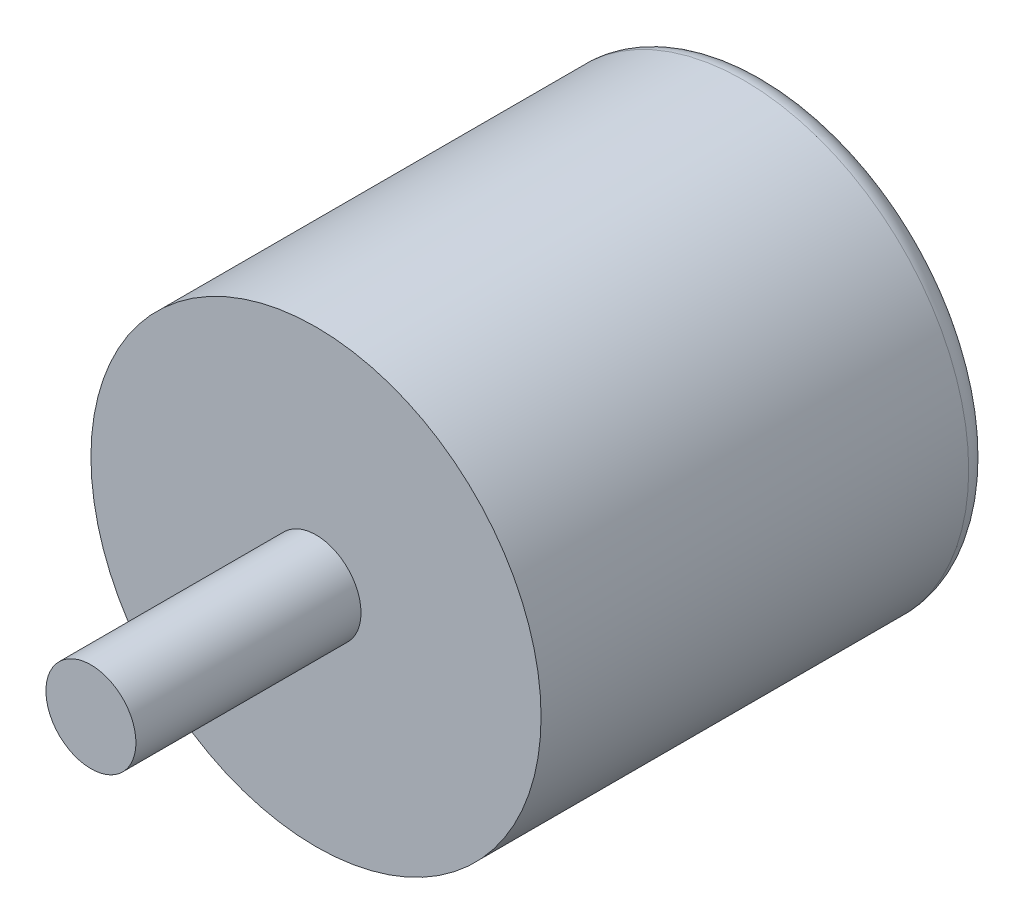
ISO-10303-21;
HEADER;
FILE_DESCRIPTION(('STEP AP214'),'2;1');
FILE_NAME('part.step','',(''),(''),'','','');
FILE_SCHEMA(('AUTOMOTIVE_DESIGN { 1 0 10303 214 1 1 1 1 }'));
ENDSEC;
DATA;
#1=APPLICATION_CONTEXT('core data for automotive mechanical design processes');
#2=APPLICATION_PROTOCOL_DEFINITION('international standard','automotive_design',2000,#1);
#3=PRODUCT_CONTEXT('',#1,'mechanical');
#4=PRODUCT('Part','Part','',(#3));
#5=PRODUCT_RELATED_PRODUCT_CATEGORY('part','',(#4));
#6=PRODUCT_DEFINITION_FORMATION('','',#4);
#7=PRODUCT_DEFINITION_CONTEXT('part definition',#1,'design');
#8=PRODUCT_DEFINITION('design','',#6,#7);
#9=PRODUCT_DEFINITION_SHAPE('','',#8);
#10=(LENGTH_UNIT() NAMED_UNIT(*) SI_UNIT(.MILLI.,.METRE.));
#11=(NAMED_UNIT(*) PLANE_ANGLE_UNIT() SI_UNIT($,.RADIAN.));
#12=(NAMED_UNIT(*) SI_UNIT($,.STERADIAN.) SOLID_ANGLE_UNIT());
#13=UNCERTAINTY_MEASURE_WITH_UNIT(LENGTH_MEASURE(1.E-05),#10,'distance_accuracy_value','');
#14=(GEOMETRIC_REPRESENTATION_CONTEXT(3) GLOBAL_UNCERTAINTY_ASSIGNED_CONTEXT((#13)) GLOBAL_UNIT_ASSIGNED_CONTEXT((#10,
#11,#12)) REPRESENTATION_CONTEXT('',''));
#15=CARTESIAN_POINT('',(0.,0.,0.));
#16=DIRECTION('',(0.,0.,1.));
#17=DIRECTION('',(1.,0.,0.));
#18=AXIS2_PLACEMENT_3D('',#15,#16,#17);
#19=CARTESIAN_POINT('',(0.,0.,25.4));
#20=DIRECTION('',(0.,0.,-1.));
#21=DIRECTION('',(-1.,0.,0.));
#22=AXIS2_PLACEMENT_3D('',#19,#20,#21);
#23=CYLINDRICAL_SURFACE('',#22,12.7);
#24=CARTESIAN_POINT('',(0.,0.,1.27));
#25=DIRECTION('',(0.,0.,1.));
#26=DIRECTION('',(1.,0.,0.));
#27=AXIS2_PLACEMENT_3D('',#24,#25,#26);
#28=CIRCLE('',#27,12.7);
#29=CARTESIAN_POINT('',(12.7,0.,1.27));
#30=VERTEX_POINT('',#29);
#31=EDGE_CURVE('E45',#30,#30,#28,.T.);
#32=ORIENTED_EDGE('',*,*,#31,.T.);
#33=EDGE_LOOP('',(#32));
#34=FACE_BOUND('',#33,.T.);
#35=CARTESIAN_POINT('',(0.,0.,25.4));
#36=DIRECTION('',(0.,0.,1.));
#37=DIRECTION('',(1.,0.,0.));
#38=AXIS2_PLACEMENT_3D('',#35,#36,#37);
#39=CIRCLE('',#38,12.7);
#40=CARTESIAN_POINT('',(12.7,0.,25.4));
#41=VERTEX_POINT('',#40);
#42=EDGE_CURVE('E55',#41,#41,#39,.T.);
#43=ORIENTED_EDGE('',*,*,#42,.F.);
#44=EDGE_LOOP('',(#43));
#45=FACE_BOUND('',#44,.T.);
#46=ADVANCED_FACE('F37',(#34,#45),#23,.T.);
#47=CARTESIAN_POINT('',(0.,0.,25.4));
#48=DIRECTION('',(0.,0.,1.));
#49=DIRECTION('',(1.,0.,0.));
#50=AXIS2_PLACEMENT_3D('',#47,#48,#49);
#51=PLANE('',#50);
#52=CARTESIAN_POINT('',(0.,0.,25.4));
#53=DIRECTION('',(0.,0.,1.));
#54=DIRECTION('',(1.,0.,0.));
#55=AXIS2_PLACEMENT_3D('',#52,#53,#54);
#56=CIRCLE('',#55,2.54);
#57=CARTESIAN_POINT('',(2.54,0.,25.4));
#58=VERTEX_POINT('',#57);
#59=EDGE_CURVE('E50',#58,#58,#56,.T.);
#60=ORIENTED_EDGE('',*,*,#59,.F.);
#61=EDGE_LOOP('',(#60));
#62=FACE_BOUND('',#61,.T.);
#63=ORIENTED_EDGE('',*,*,#42,.T.);
#64=EDGE_LOOP('',(#63));
#65=FACE_BOUND('',#64,.T.);
#66=ADVANCED_FACE('F75',(#62,#65),#51,.T.);
#67=CARTESIAN_POINT('',(0.,0.,0.));
#68=DIRECTION('',(0.,0.,1.));
#69=DIRECTION('',(1.,0.,0.));
#70=AXIS2_PLACEMENT_3D('',#67,#68,#69);
#71=PLANE('',#70);
#72=CARTESIAN_POINT('',(0.,0.,0.));
#73=DIRECTION('',(0.,0.,1.));
#74=DIRECTION('',(1.,0.,0.));
#75=AXIS2_PLACEMENT_3D('',#72,#73,#74);
#76=CIRCLE('',#75,11.43);
#77=CARTESIAN_POINT('',(11.43,0.,0.));
#78=VERTEX_POINT('',#77);
#79=EDGE_CURVE('E10',#78,#78,#76,.F.);
#80=ORIENTED_EDGE('',*,*,#79,.T.);
#81=EDGE_LOOP('',(#80));
#82=FACE_BOUND('',#81,.T.);
#83=ADVANCED_FACE('F71',(#82),#71,.F.);
#84=CARTESIAN_POINT('',(0.,0.,38.1));
#85=DIRECTION('',(0.,0.,-1.));
#86=DIRECTION('',(-1.,0.,0.));
#87=AXIS2_PLACEMENT_3D('',#84,#85,#86);
#88=CYLINDRICAL_SURFACE('',#87,2.54);
#89=CARTESIAN_POINT('',(0.,0.,38.1));
#90=DIRECTION('',(0.,0.,1.));
#91=DIRECTION('',(1.,0.,0.));
#92=AXIS2_PLACEMENT_3D('',#89,#90,#91);
#93=CIRCLE('',#92,2.54);
#94=CARTESIAN_POINT('',(2.54,0.,38.1));
#95=VERTEX_POINT('',#94);
#96=EDGE_CURVE('E60',#95,#95,#93,.T.);
#97=ORIENTED_EDGE('',*,*,#96,.F.);
#98=EDGE_LOOP('',(#97));
#99=FACE_BOUND('',#98,.T.);
#100=ORIENTED_EDGE('',*,*,#59,.T.);
#101=EDGE_LOOP('',(#100));
#102=FACE_BOUND('',#101,.T.);
#103=ADVANCED_FACE('F68',(#99,#102),#88,.T.);
#104=CARTESIAN_POINT('',(0.,0.,38.1));
#105=DIRECTION('',(0.,0.,1.));
#106=DIRECTION('',(1.,0.,0.));
#107=AXIS2_PLACEMENT_3D('',#104,#105,#106);
#108=PLANE('',#107);
#109=ORIENTED_EDGE('',*,*,#96,.T.);
#110=EDGE_LOOP('',(#109));
#111=FACE_BOUND('',#110,.T.);
#112=ADVANCED_FACE('F66',(#111),#108,.T.);
#113=CARTESIAN_POINT('',(0.,0.,1.27));
#114=DIRECTION('',(0.,0.,1.));
#115=DIRECTION('',(1.,0.,0.));
#116=AXIS2_PLACEMENT_3D('',#113,#114,#115);
#117=TOROIDAL_SURFACE('',#116,11.43,1.27);
#118=ORIENTED_EDGE('',*,*,#79,.F.);
#119=EDGE_LOOP('',(#118));
#120=FACE_BOUND('',#119,.T.);
#121=ORIENTED_EDGE('',*,*,#31,.F.);
#122=EDGE_LOOP('',(#121));
#123=FACE_BOUND('',#122,.T.);
#124=ADVANCED_FACE('F39',(#120,#123),#117,.T.);
#125=CLOSED_SHELL('',(#46,#66,#83,#103,#112,#124));
#126=MANIFOLD_SOLID_BREP('B2',#125);
#127=ADVANCED_BREP_SHAPE_REPRESENTATION('',(#18,#126),#14);
#128=SHAPE_DEFINITION_REPRESENTATION(#9,#127);
ENDSEC;
END-ISO-10303-21;
